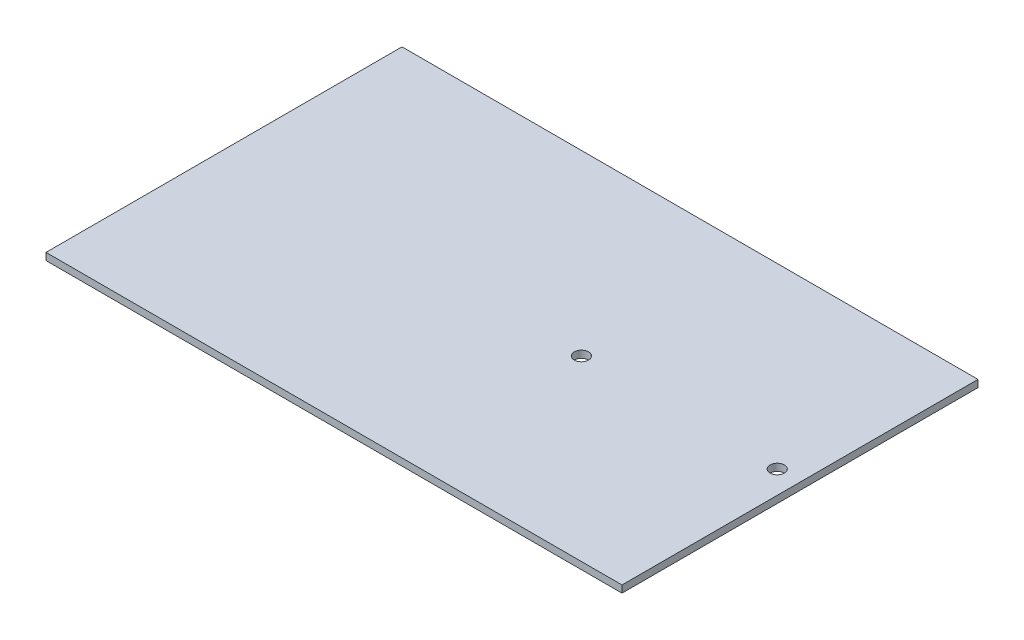
ISO-10303-21;
HEADER;
FILE_DESCRIPTION(('STEP AP214'),'2;1');
FILE_NAME('part.step','',(''),(''),'','','');
FILE_SCHEMA(('AUTOMOTIVE_DESIGN { 1 0 10303 214 1 1 1 1 }'));
ENDSEC;
DATA;
#1=APPLICATION_CONTEXT('core data for automotive mechanical design processes');
#2=APPLICATION_PROTOCOL_DEFINITION('international standard','automotive_design',2000,#1);
#3=PRODUCT_CONTEXT('',#1,'mechanical');
#4=PRODUCT('Part','Part','',(#3));
#5=PRODUCT_RELATED_PRODUCT_CATEGORY('part','',(#4));
#6=PRODUCT_DEFINITION_FORMATION('','',#4);
#7=PRODUCT_DEFINITION_CONTEXT('part definition',#1,'design');
#8=PRODUCT_DEFINITION('design','',#6,#7);
#9=PRODUCT_DEFINITION_SHAPE('','',#8);
#10=(LENGTH_UNIT() NAMED_UNIT(*) SI_UNIT(.MILLI.,.METRE.));
#11=(NAMED_UNIT(*) PLANE_ANGLE_UNIT() SI_UNIT($,.RADIAN.));
#12=(NAMED_UNIT(*) SI_UNIT($,.STERADIAN.) SOLID_ANGLE_UNIT());
#13=UNCERTAINTY_MEASURE_WITH_UNIT(LENGTH_MEASURE(1.E-05),#10,'distance_accuracy_value','');
#14=(GEOMETRIC_REPRESENTATION_CONTEXT(3) GLOBAL_UNCERTAINTY_ASSIGNED_CONTEXT((#13)) GLOBAL_UNIT_ASSIGNED_CONTEXT((#10,
#11,#12)) REPRESENTATION_CONTEXT('',''));
#15=CARTESIAN_POINT('',(0.,0.,0.));
#16=DIRECTION('',(0.,0.,1.));
#17=DIRECTION('',(1.,0.,0.));
#18=AXIS2_PLACEMENT_3D('',#15,#16,#17);
#19=CARTESIAN_POINT('',(40.45,1.,25.));
#20=DIRECTION('',(-1.,0.,0.));
#21=DIRECTION('',(0.,0.,1.));
#22=AXIS2_PLACEMENT_3D('',#19,#20,#21);
#23=PLANE('',#22);
#24=DIRECTION('',(0.,0.,-1.));
#25=VECTOR('',#24,1.);
#26=CARTESIAN_POINT('',(40.45,0.,25.));
#27=LINE('',#26,#25);
#28=CARTESIAN_POINT('',(40.45,0.,25.));
#29=VERTEX_POINT('',#28);
#30=CARTESIAN_POINT('',(40.45,0.,-25.));
#31=VERTEX_POINT('',#30);
#32=EDGE_CURVE('E99',#29,#31,#27,.T.);
#33=ORIENTED_EDGE('',*,*,#32,.T.);
#34=DIRECTION('',(0.,-1.,0.));
#35=VECTOR('',#34,1.);
#36=CARTESIAN_POINT('',(40.45,1.,-25.));
#37=LINE('',#36,#35);
#38=CARTESIAN_POINT('',(40.45,1.,-25.));
#39=VERTEX_POINT('',#38);
#40=EDGE_CURVE('E11',#39,#31,#37,.T.);
#41=ORIENTED_EDGE('',*,*,#40,.F.);
#42=DIRECTION('',(0.,0.,-1.));
#43=VECTOR('',#42,1.);
#44=CARTESIAN_POINT('',(40.45,1.,25.));
#45=LINE('',#44,#43);
#46=CARTESIAN_POINT('',(40.45,1.,25.));
#47=VERTEX_POINT('',#46);
#48=EDGE_CURVE('E87',#47,#39,#45,.T.);
#49=ORIENTED_EDGE('',*,*,#48,.F.);
#50=DIRECTION('',(0.,-1.,0.));
#51=VECTOR('',#50,1.);
#52=CARTESIAN_POINT('',(40.45,1.,25.));
#53=LINE('',#52,#51);
#54=EDGE_CURVE('E95',#47,#29,#53,.T.);
#55=ORIENTED_EDGE('',*,*,#54,.T.);
#56=EDGE_LOOP('',(#33,#41,#49,#55));
#57=FACE_BOUND('',#56,.T.);
#58=ADVANCED_FACE('F36',(#57),#23,.F.);
#59=CARTESIAN_POINT('',(-40.45,1.,-25.));
#60=DIRECTION('',(0.,0.,1.));
#61=DIRECTION('',(1.,0.,0.));
#62=AXIS2_PLACEMENT_3D('',#59,#60,#61);
#63=PLANE('',#62);
#64=DIRECTION('',(-1.,0.,0.));
#65=VECTOR('',#64,1.);
#66=CARTESIAN_POINT('',(-40.45,0.,-25.));
#67=LINE('',#66,#65);
#68=CARTESIAN_POINT('',(-40.45,0.,-25.));
#69=VERTEX_POINT('',#68);
#70=EDGE_CURVE('E91',#31,#69,#67,.T.);
#71=ORIENTED_EDGE('',*,*,#70,.T.);
#72=DIRECTION('',(0.,-1.,0.));
#73=VECTOR('',#72,1.);
#74=CARTESIAN_POINT('',(-40.45,1.,-25.));
#75=LINE('',#74,#73);
#76=CARTESIAN_POINT('',(-40.45,1.,-25.));
#77=VERTEX_POINT('',#76);
#78=EDGE_CURVE('E44',#77,#69,#75,.T.);
#79=ORIENTED_EDGE('',*,*,#78,.F.);
#80=DIRECTION('',(-1.,0.,0.));
#81=VECTOR('',#80,1.);
#82=CARTESIAN_POINT('',(-40.45,1.,-25.));
#83=LINE('',#82,#81);
#84=EDGE_CURVE('E82',#39,#77,#83,.T.);
#85=ORIENTED_EDGE('',*,*,#84,.F.);
#86=ORIENTED_EDGE('',*,*,#40,.T.);
#87=EDGE_LOOP('',(#71,#79,#85,#86));
#88=FACE_BOUND('',#87,.T.);
#89=ADVANCED_FACE('F90',(#88),#63,.F.);
#90=CARTESIAN_POINT('',(-40.45,1.,25.));
#91=DIRECTION('',(1.,0.,0.));
#92=DIRECTION('',(0.,0.,-1.));
#93=AXIS2_PLACEMENT_3D('',#90,#91,#92);
#94=PLANE('',#93);
#95=DIRECTION('',(0.,0.,1.));
#96=VECTOR('',#95,1.);
#97=CARTESIAN_POINT('',(-40.45,0.,25.));
#98=LINE('',#97,#96);
#99=CARTESIAN_POINT('',(-40.45,0.,25.));
#100=VERTEX_POINT('',#99);
#101=EDGE_CURVE('E69',#69,#100,#98,.T.);
#102=ORIENTED_EDGE('',*,*,#101,.T.);
#103=DIRECTION('',(0.,-1.,0.));
#104=VECTOR('',#103,1.);
#105=CARTESIAN_POINT('',(-40.45,1.,25.));
#106=LINE('',#105,#104);
#107=CARTESIAN_POINT('',(-40.45,1.,25.));
#108=VERTEX_POINT('',#107);
#109=EDGE_CURVE('E92',#108,#100,#106,.T.);
#110=ORIENTED_EDGE('',*,*,#109,.F.);
#111=DIRECTION('',(0.,0.,1.));
#112=VECTOR('',#111,1.);
#113=CARTESIAN_POINT('',(-40.45,1.,25.));
#114=LINE('',#113,#112);
#115=EDGE_CURVE('E85',#77,#108,#114,.T.);
#116=ORIENTED_EDGE('',*,*,#115,.F.);
#117=ORIENTED_EDGE('',*,*,#78,.T.);
#118=EDGE_LOOP('',(#102,#110,#116,#117));
#119=FACE_BOUND('',#118,.T.);
#120=ADVANCED_FACE('F93',(#119),#94,.F.);
#121=CARTESIAN_POINT('',(-40.45,1.,25.));
#122=DIRECTION('',(0.,0.,-1.));
#123=DIRECTION('',(-1.,0.,0.));
#124=AXIS2_PLACEMENT_3D('',#121,#122,#123);
#125=PLANE('',#124);
#126=DIRECTION('',(1.,0.,0.));
#127=VECTOR('',#126,1.);
#128=CARTESIAN_POINT('',(-40.45,0.,25.));
#129=LINE('',#128,#127);
#130=EDGE_CURVE('E75',#100,#29,#129,.T.);
#131=ORIENTED_EDGE('',*,*,#130,.T.);
#132=ORIENTED_EDGE('',*,*,#54,.F.);
#133=DIRECTION('',(1.,0.,0.));
#134=VECTOR('',#133,1.);
#135=CARTESIAN_POINT('',(-40.45,1.,25.));
#136=LINE('',#135,#134);
#137=EDGE_CURVE('E52',#108,#47,#136,.T.);
#138=ORIENTED_EDGE('',*,*,#137,.F.);
#139=ORIENTED_EDGE('',*,*,#109,.T.);
#140=EDGE_LOOP('',(#131,#132,#138,#139));
#141=FACE_BOUND('',#140,.T.);
#142=ADVANCED_FACE('F107',(#141),#125,.F.);
#143=CARTESIAN_POINT('',(0.,1.,0.));
#144=DIRECTION('',(0.,-1.,0.));
#145=DIRECTION('',(0.,0.,-1.));
#146=AXIS2_PLACEMENT_3D('',#143,#144,#145);
#147=PLANE('',#146);
#148=CARTESIAN_POINT('',(9.75,1.,0.));
#149=DIRECTION('',(0.,1.,0.));
#150=DIRECTION('',(0.,0.,1.));
#151=AXIS2_PLACEMENT_3D('',#148,#149,#150);
#152=CIRCLE('',#151,1.);
#153=CARTESIAN_POINT('',(9.75,1.,1.));
#154=VERTEX_POINT('',#153);
#155=EDGE_CURVE('E119',#154,#154,#152,.T.);
#156=ORIENTED_EDGE('',*,*,#155,.F.);
#157=EDGE_LOOP('',(#156));
#158=FACE_BOUND('',#157,.T.);
#159=CARTESIAN_POINT('',(37.25,1.,0.));
#160=DIRECTION('',(0.,1.,0.));
#161=DIRECTION('',(0.,0.,1.));
#162=AXIS2_PLACEMENT_3D('',#159,#160,#161);
#163=CIRCLE('',#162,0.999999999999998);
#164=CARTESIAN_POINT('',(37.25,1.,0.999999999999998));
#165=VERTEX_POINT('',#164);
#166=EDGE_CURVE('E113',#165,#165,#163,.T.);
#167=ORIENTED_EDGE('',*,*,#166,.F.);
#168=EDGE_LOOP('',(#167));
#169=FACE_BOUND('',#168,.T.);
#170=ORIENTED_EDGE('',*,*,#48,.T.);
#171=ORIENTED_EDGE('',*,*,#84,.T.);
#172=ORIENTED_EDGE('',*,*,#115,.T.);
#173=ORIENTED_EDGE('',*,*,#137,.T.);
#174=EDGE_LOOP('',(#170,#171,#172,#173));
#175=FACE_BOUND('',#174,.T.);
#176=ADVANCED_FACE('F83',(#158,#169,#175),#147,.F.);
#177=CARTESIAN_POINT('',(0.,0.,0.));
#178=DIRECTION('',(0.,-1.,0.));
#179=DIRECTION('',(0.,0.,-1.));
#180=AXIS2_PLACEMENT_3D('',#177,#178,#179);
#181=PLANE('',#180);
#182=CARTESIAN_POINT('',(9.75,0.,0.));
#183=DIRECTION('',(0.,1.,0.));
#184=DIRECTION('',(0.,0.,1.));
#185=AXIS2_PLACEMENT_3D('',#182,#183,#184);
#186=CIRCLE('',#185,1.);
#187=CARTESIAN_POINT('',(9.75,0.,1.));
#188=VERTEX_POINT('',#187);
#189=EDGE_CURVE('E116',#188,#188,#186,.T.);
#190=ORIENTED_EDGE('',*,*,#189,.T.);
#191=EDGE_LOOP('',(#190));
#192=FACE_BOUND('',#191,.T.);
#193=CARTESIAN_POINT('',(37.25,0.,0.));
#194=DIRECTION('',(0.,1.,0.));
#195=DIRECTION('',(0.,0.,1.));
#196=AXIS2_PLACEMENT_3D('',#193,#194,#195);
#197=CIRCLE('',#196,0.999999999999998);
#198=CARTESIAN_POINT('',(37.25,0.,0.999999999999998));
#199=VERTEX_POINT('',#198);
#200=EDGE_CURVE('E102',#199,#199,#197,.T.);
#201=ORIENTED_EDGE('',*,*,#200,.T.);
#202=EDGE_LOOP('',(#201));
#203=FACE_BOUND('',#202,.T.);
#204=ORIENTED_EDGE('',*,*,#32,.F.);
#205=ORIENTED_EDGE('',*,*,#130,.F.);
#206=ORIENTED_EDGE('',*,*,#101,.F.);
#207=ORIENTED_EDGE('',*,*,#70,.F.);
#208=EDGE_LOOP('',(#204,#205,#206,#207));
#209=FACE_BOUND('',#208,.T.);
#210=ADVANCED_FACE('F110',(#192,#203,#209),#181,.T.);
#211=CARTESIAN_POINT('',(37.25,0.,0.));
#212=DIRECTION('',(0.,1.,0.));
#213=DIRECTION('',(0.,0.,1.));
#214=AXIS2_PLACEMENT_3D('',#211,#212,#213);
#215=CYLINDRICAL_SURFACE('',#214,0.999999999999998);
#216=ORIENTED_EDGE('',*,*,#200,.F.);
#217=EDGE_LOOP('',(#216));
#218=FACE_BOUND('',#217,.T.);
#219=ORIENTED_EDGE('',*,*,#166,.T.);
#220=EDGE_LOOP('',(#219));
#221=FACE_BOUND('',#220,.T.);
#222=ADVANCED_FACE('F130',(#218,#221),#215,.F.);
#223=CARTESIAN_POINT('',(9.75,0.,0.));
#224=DIRECTION('',(0.,1.,0.));
#225=DIRECTION('',(0.,0.,1.));
#226=AXIS2_PLACEMENT_3D('',#223,#224,#225);
#227=CYLINDRICAL_SURFACE('',#226,1.);
#228=ORIENTED_EDGE('',*,*,#189,.F.);
#229=EDGE_LOOP('',(#228));
#230=FACE_BOUND('',#229,.T.);
#231=ORIENTED_EDGE('',*,*,#155,.T.);
#232=EDGE_LOOP('',(#231));
#233=FACE_BOUND('',#232,.T.);
#234=ADVANCED_FACE('F127',(#230,#233),#227,.F.);
#235=CLOSED_SHELL('',(#58,#89,#120,#142,#176,#210,#222,#234));
#236=MANIFOLD_SOLID_BREP('B2',#235);
#237=ADVANCED_BREP_SHAPE_REPRESENTATION('',(#18,#236),#14);
#238=SHAPE_DEFINITION_REPRESENTATION(#9,#237);
ENDSEC;
END-ISO-10303-21;
